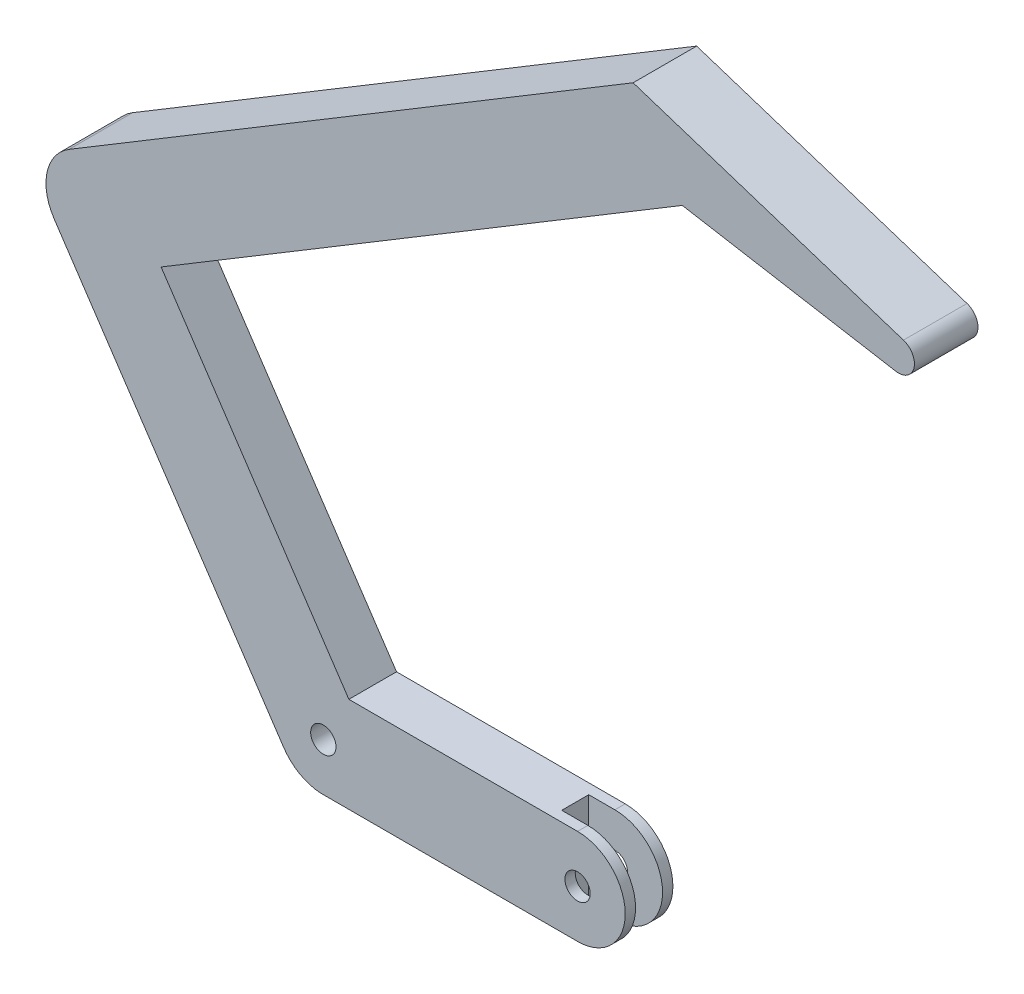
ISO-10303-21;
HEADER;
FILE_DESCRIPTION(('STEP AP214'),'2;1');
FILE_NAME('part.step','',(''),(''),'','','');
FILE_SCHEMA(('AUTOMOTIVE_DESIGN { 1 0 10303 214 1 1 1 1 }'));
ENDSEC;
DATA;
#1=APPLICATION_CONTEXT('core data for automotive mechanical design processes');
#2=APPLICATION_PROTOCOL_DEFINITION('international standard','automotive_design',2000,#1);
#3=PRODUCT_CONTEXT('',#1,'mechanical');
#4=PRODUCT('Part','Part','',(#3));
#5=PRODUCT_RELATED_PRODUCT_CATEGORY('part','',(#4));
#6=PRODUCT_DEFINITION_FORMATION('','',#4);
#7=PRODUCT_DEFINITION_CONTEXT('part definition',#1,'design');
#8=PRODUCT_DEFINITION('design','',#6,#7);
#9=PRODUCT_DEFINITION_SHAPE('','',#8);
#10=(LENGTH_UNIT() NAMED_UNIT(*) SI_UNIT(.MILLI.,.METRE.));
#11=(NAMED_UNIT(*) PLANE_ANGLE_UNIT() SI_UNIT($,.RADIAN.));
#12=(NAMED_UNIT(*) SI_UNIT($,.STERADIAN.) SOLID_ANGLE_UNIT());
#13=UNCERTAINTY_MEASURE_WITH_UNIT(LENGTH_MEASURE(1.E-05),#10,'distance_accuracy_value','');
#14=(GEOMETRIC_REPRESENTATION_CONTEXT(3) GLOBAL_UNCERTAINTY_ASSIGNED_CONTEXT((#13)) GLOBAL_UNIT_ASSIGNED_CONTEXT((#10,
#11,#12)) REPRESENTATION_CONTEXT('',''));
#15=CARTESIAN_POINT('',(0.,0.,0.));
#16=DIRECTION('',(0.,0.,1.));
#17=DIRECTION('',(1.,0.,0.));
#18=AXIS2_PLACEMENT_3D('',#15,#16,#17);
#19=CARTESIAN_POINT('',(80.,0.,15.));
#20=DIRECTION('',(0.,0.,-1.));
#21=DIRECTION('',(-1.,0.,0.));
#22=AXIS2_PLACEMENT_3D('',#19,#20,#21);
#23=CYLINDRICAL_SURFACE('',#22,15.);
#24=CARTESIAN_POINT('',(80.,0.,11.75));
#25=DIRECTION('',(0.,0.,1.));
#26=DIRECTION('',(1.,0.,0.));
#27=AXIS2_PLACEMENT_3D('',#24,#25,#26);
#28=CIRCLE('',#27,15.);
#29=CARTESIAN_POINT('',(80.,-15.,11.75));
#30=VERTEX_POINT('',#29);
#31=CARTESIAN_POINT('',(80.,15.,11.75));
#32=VERTEX_POINT('',#31);
#33=EDGE_CURVE('E333',#30,#32,#28,.T.);
#34=ORIENTED_EDGE('',*,*,#33,.T.);
#35=DIRECTION('',(0.,0.,-1.));
#36=VECTOR('',#35,1.);
#37=CARTESIAN_POINT('',(80.,15.,15.));
#38=LINE('',#37,#36);
#39=CARTESIAN_POINT('',(80.,15.,15.));
#40=VERTEX_POINT('',#39);
#41=EDGE_CURVE('E362',#40,#32,#38,.T.);
#42=ORIENTED_EDGE('',*,*,#41,.F.);
#43=CARTESIAN_POINT('',(80.,0.,15.));
#44=DIRECTION('',(0.,0.,1.));
#45=DIRECTION('',(1.,0.,0.));
#46=AXIS2_PLACEMENT_3D('',#43,#44,#45);
#47=CIRCLE('',#46,15.);
#48=CARTESIAN_POINT('',(80.,-15.,15.));
#49=VERTEX_POINT('',#48);
#50=EDGE_CURVE('E344',#49,#40,#47,.T.);
#51=ORIENTED_EDGE('',*,*,#50,.F.);
#52=DIRECTION('',(0.,0.,-1.));
#53=VECTOR('',#52,1.);
#54=CARTESIAN_POINT('',(80.,-15.,15.));
#55=LINE('',#54,#53);
#56=EDGE_CURVE('E367',#49,#30,#55,.T.);
#57=ORIENTED_EDGE('',*,*,#56,.T.);
#58=EDGE_LOOP('',(#34,#42,#51,#57));
#59=FACE_BOUND('',#58,.T.);
#60=ADVANCED_FACE('F49',(#59),#23,.T.);
#61=CARTESIAN_POINT('',(0.,-15.,15.));
#62=DIRECTION('',(0.,1.,0.));
#63=DIRECTION('',(0.,0.,1.));
#64=AXIS2_PLACEMENT_3D('',#61,#62,#63);
#65=PLANE('',#64);
#66=DIRECTION('',(1.,0.,0.));
#67=VECTOR('',#66,1.);
#68=CARTESIAN_POINT('',(0.,-15.,15.));
#69=LINE('',#68,#67);
#70=CARTESIAN_POINT('',(0.784551439243232,-15.,15.));
#71=VERTEX_POINT('',#70);
#72=EDGE_CURVE('E341',#71,#49,#69,.T.);
#73=ORIENTED_EDGE('',*,*,#72,.F.);
#74=DIRECTION('',(0.,0.,1.));
#75=VECTOR('',#74,1.);
#76=CARTESIAN_POINT('',(0.784551439243232,-15.,0.));
#77=LINE('',#76,#75);
#78=CARTESIAN_POINT('',(0.784551439243232,-15.,0.));
#79=VERTEX_POINT('',#78);
#80=EDGE_CURVE('E289',#71,#79,#77,.F.);
#81=ORIENTED_EDGE('',*,*,#80,.T.);
#82=DIRECTION('',(1.,0.,0.));
#83=VECTOR('',#82,1.);
#84=CARTESIAN_POINT('',(0.,-15.,0.));
#85=LINE('',#84,#83);
#86=CARTESIAN_POINT('',(80.,-15.,0.));
#87=VERTEX_POINT('',#86);
#88=EDGE_CURVE('E340',#79,#87,#85,.T.);
#89=ORIENTED_EDGE('',*,*,#88,.T.);
#90=CARTESIAN_POINT('',(80.,-15.,3.25));
#91=VERTEX_POINT('',#90);
#92=EDGE_CURVE('E366',#91,#87,#55,.T.);
#93=ORIENTED_EDGE('',*,*,#92,.F.);
#94=DIRECTION('',(-1.,0.,0.));
#95=VECTOR('',#94,1.);
#96=CARTESIAN_POINT('',(0.,-15.,3.25));
#97=LINE('',#96,#95);
#98=CARTESIAN_POINT('',(71.7692085698296,-15.,3.25));
#99=VERTEX_POINT('',#98);
#100=EDGE_CURVE('E329',#91,#99,#97,.T.);
#101=ORIENTED_EDGE('',*,*,#100,.T.);
#102=DIRECTION('',(0.,0.,1.));
#103=VECTOR('',#102,1.);
#104=CARTESIAN_POINT('',(71.7692085698296,-15.,15.));
#105=LINE('',#104,#103);
#106=CARTESIAN_POINT('',(71.7692085698296,-15.,11.75));
#107=VERTEX_POINT('',#106);
#108=EDGE_CURVE('E319',#99,#107,#105,.T.);
#109=ORIENTED_EDGE('',*,*,#108,.T.);
#110=DIRECTION('',(1.,0.,0.));
#111=VECTOR('',#110,1.);
#112=CARTESIAN_POINT('',(0.,-15.,11.75));
#113=LINE('',#112,#111);
#114=EDGE_CURVE('E336',#107,#30,#113,.T.);
#115=ORIENTED_EDGE('',*,*,#114,.T.);
#116=ORIENTED_EDGE('',*,*,#56,.F.);
#117=EDGE_LOOP('',(#73,#81,#89,#93,#101,#109,#115,#116));
#118=FACE_BOUND('',#117,.T.);
#119=ADVANCED_FACE('F489',(#118),#65,.F.);
#120=CARTESIAN_POINT('',(80.,15.,3.25));
#121=VERTEX_POINT('',#120);
#122=CARTESIAN_POINT('',(80.,15.,0.));
#123=VERTEX_POINT('',#122);
#124=EDGE_CURVE('E352',#121,#123,#38,.T.);
#125=ORIENTED_EDGE('',*,*,#124,.F.);
#126=CARTESIAN_POINT('',(80.,0.,3.25));
#127=DIRECTION('',(0.,0.,-1.));
#128=DIRECTION('',(-1.,0.,0.));
#129=AXIS2_PLACEMENT_3D('',#126,#127,#128);
#130=CIRCLE('',#129,15.);
#131=EDGE_CURVE('E325',#121,#91,#130,.T.);
#132=ORIENTED_EDGE('',*,*,#131,.T.);
#133=ORIENTED_EDGE('',*,*,#92,.T.);
#134=CARTESIAN_POINT('',(80.,0.,0.));
#135=DIRECTION('',(0.,0.,1.));
#136=DIRECTION('',(1.,0.,0.));
#137=AXIS2_PLACEMENT_3D('',#134,#135,#136);
#138=CIRCLE('',#137,15.);
#139=EDGE_CURVE('E355',#87,#123,#138,.T.);
#140=ORIENTED_EDGE('',*,*,#139,.T.);
#141=EDGE_LOOP('',(#125,#132,#133,#140));
#142=FACE_BOUND('',#141,.T.);
#143=ADVANCED_FACE('F460',(#142),#23,.T.);
#144=CARTESIAN_POINT('',(0.,15.,15.));
#145=DIRECTION('',(0.,-1.,0.));
#146=DIRECTION('',(0.,0.,-1.));
#147=AXIS2_PLACEMENT_3D('',#144,#145,#146);
#148=PLANE('',#147);
#149=DIRECTION('',(-1.,0.,0.));
#150=VECTOR('',#149,1.);
#151=CARTESIAN_POINT('',(0.,15.,0.));
#152=LINE('',#151,#150);
#153=CARTESIAN_POINT('',(8.03505045378055,15.,0.));
#154=VERTEX_POINT('',#153);
#155=EDGE_CURVE('E345',#123,#154,#152,.T.);
#156=ORIENTED_EDGE('',*,*,#155,.T.);
#157=DIRECTION('',(0.,0.,1.));
#158=VECTOR('',#157,1.);
#159=CARTESIAN_POINT('',(8.03505045378055,15.,15.));
#160=LINE('',#159,#158);
#161=CARTESIAN_POINT('',(8.03505045378055,15.,15.));
#162=VERTEX_POINT('',#161);
#163=EDGE_CURVE('E283',#154,#162,#160,.T.);
#164=ORIENTED_EDGE('',*,*,#163,.T.);
#165=DIRECTION('',(-1.,0.,0.));
#166=VECTOR('',#165,1.);
#167=CARTESIAN_POINT('',(0.,15.,15.));
#168=LINE('',#167,#166);
#169=EDGE_CURVE('E348',#40,#162,#168,.T.);
#170=ORIENTED_EDGE('',*,*,#169,.F.);
#171=ORIENTED_EDGE('',*,*,#41,.T.);
#172=DIRECTION('',(-1.,0.,0.));
#173=VECTOR('',#172,1.);
#174=CARTESIAN_POINT('',(0.,15.,11.75));
#175=LINE('',#174,#173);
#176=CARTESIAN_POINT('',(71.7692085698296,15.,11.75));
#177=VERTEX_POINT('',#176);
#178=EDGE_CURVE('E371',#32,#177,#175,.T.);
#179=ORIENTED_EDGE('',*,*,#178,.T.);
#180=DIRECTION('',(0.,0.,-1.));
#181=VECTOR('',#180,1.);
#182=CARTESIAN_POINT('',(71.7692085698296,15.,11.75));
#183=LINE('',#182,#181);
#184=CARTESIAN_POINT('',(71.7692085698296,15.,3.25));
#185=VERTEX_POINT('',#184);
#186=EDGE_CURVE('E306',#177,#185,#183,.T.);
#187=ORIENTED_EDGE('',*,*,#186,.T.);
#188=DIRECTION('',(1.,0.,0.));
#189=VECTOR('',#188,1.);
#190=CARTESIAN_POINT('',(71.7692085698296,15.,3.25));
#191=LINE('',#190,#189);
#192=EDGE_CURVE('E310',#185,#121,#191,.T.);
#193=ORIENTED_EDGE('',*,*,#192,.T.);
#194=ORIENTED_EDGE('',*,*,#124,.T.);
#195=EDGE_LOOP('',(#156,#164,#170,#171,#179,#187,#193,#194));
#196=FACE_BOUND('',#195,.T.);
#197=ADVANCED_FACE('F456',(#196),#148,.F.);
#198=CARTESIAN_POINT('',(0.,0.,15.));
#199=DIRECTION('',(0.,0.,1.));
#200=DIRECTION('',(1.,0.,0.));
#201=AXIS2_PLACEMENT_3D('',#198,#199,#200);
#202=PLANE('',#201);
#203=DIRECTION('',(0.985426337156866,-0.170102716138227,0.));
#204=VECTOR('',#203,1.);
#205=CARTESIAN_POINT('',(249.011128894695,178.572894151073,15.));
#206=LINE('',#205,#204);
#207=CARTESIAN_POINT('',(112.956276539485,202.058464869814,15.));
#208=VERTEX_POINT('',#207);
#209=CARTESIAN_POINT('',(180.158514372488,190.458122200932,15.));
#210=VERTEX_POINT('',#209);
#211=EDGE_CURVE('E227',#208,#210,#206,.T.);
#212=ORIENTED_EDGE('',*,*,#211,.T.);
#213=CARTESIAN_POINT('',(181.009027953179,195.385253886716,15.));
#214=DIRECTION('',(0.,0.,1.));
#215=DIRECTION('',(1.,0.,0.));
#216=AXIS2_PLACEMENT_3D('',#213,#214,#215);
#217=CIRCLE('',#216,5.);
#218=CARTESIAN_POINT('',(182.552458959952,200.141073556061,15.));
#219=VERTEX_POINT('',#218);
#220=EDGE_CURVE('E72',#210,#219,#217,.T.);
#221=ORIENTED_EDGE('',*,*,#220,.T.);
#222=DIRECTION('',(-0.951163933869031,0.308686201354691,0.));
#223=VECTOR('',#222,1.);
#224=CARTESIAN_POINT('',(97.4842129327797,227.748715926624,15.));
#225=LINE('',#224,#223);
#226=CARTESIAN_POINT('',(97.4842129327797,227.748715926624,15.));
#227=VERTEX_POINT('',#226);
#228=EDGE_CURVE('E210',#219,#227,#225,.T.);
#229=ORIENTED_EDGE('',*,*,#228,.T.);
#230=DIRECTION('',(-0.85663979225182,-0.515914979750306,0.));
#231=VECTOR('',#230,1.);
#232=CARTESIAN_POINT('',(-80.0186432183615,120.846861418893,15.));
#233=LINE('',#232,#231);
#234=CARTESIAN_POINT('',(-80.0186432183615,120.846861418893,15.));
#235=VERTEX_POINT('',#234);
#236=EDGE_CURVE('E203',#227,#235,#233,.T.);
#237=ORIENTED_EDGE('',*,*,#236,.T.);
#238=CARTESIAN_POINT('',(-72.282611415009,108.001735890487,15.));
#239=DIRECTION('',(0.,0.,1.));
#240=DIRECTION('',(1.,0.,0.));
#241=AXIS2_PLACEMENT_3D('',#238,#239,#240);
#242=CIRCLE('',#241,14.994780355276);
#243=CARTESIAN_POINT('',(-84.7671388117334,99.6963151556052,15.));
#244=VERTEX_POINT('',#243);
#245=EDGE_CURVE('E220',#235,#244,#242,.T.);
#246=ORIENTED_EDGE('',*,*,#245,.T.);
#247=DIRECTION('',(0.832591548587215,0.553887455374415,0.));
#248=VECTOR('',#247,1.);
#249=CARTESIAN_POINT('',(-71.9819753408451,108.201736179218,15.));
#250=LINE('',#249,#248);
#251=CARTESIAN_POINT('',(-84.7886038342346,99.682035396565,15.));
#252=VERTEX_POINT('',#251);
#253=EDGE_CURVE('E248',#252,#244,#250,.T.);
#254=ORIENTED_EDGE('',*,*,#253,.F.);
#255=DIRECTION('',(0.556198645236398,-0.831049377015106,0.));
#256=VECTOR('',#255,1.);
#257=CARTESIAN_POINT('',(-12.4827799535029,-8.35438361539881,15.));
#258=LINE('',#257,#256);
#259=CARTESIAN_POINT('',(-12.4827799535029,-8.35438361539881,15.));
#260=VERTEX_POINT('',#259);
#261=EDGE_CURVE('E260',#252,#260,#258,.T.);
#262=ORIENTED_EDGE('',*,*,#261,.T.);
#263=CARTESIAN_POINT('',(0.,0.,15.));
#264=DIRECTION('',(0.,0.,1.));
#265=DIRECTION('',(1.,0.,0.));
#266=AXIS2_PLACEMENT_3D('',#263,#264,#265);
#267=CIRCLE('',#266,15.0205033524452);
#268=EDGE_CURVE('E269',#260,#71,#267,.T.);
#269=ORIENTED_EDGE('',*,*,#268,.T.);
#270=ORIENTED_EDGE('',*,*,#72,.T.);
#271=ORIENTED_EDGE('',*,*,#50,.T.);
#272=ORIENTED_EDGE('',*,*,#169,.T.);
#273=DIRECTION('',(-0.556198645236398,0.831049377015106,0.));
#274=VECTOR('',#273,1.);
#275=CARTESIAN_POINT('',(12.4827799535029,8.35438361539881,15.));
#276=LINE('',#275,#274);
#277=CARTESIAN_POINT('',(-51.0511952305995,103.284263341374,15.));
#278=VERTEX_POINT('',#277);
#279=EDGE_CURVE('E273',#162,#278,#276,.T.);
#280=ORIENTED_EDGE('',*,*,#279,.T.);
#281=DIRECTION('',(0.85663979225182,0.515914979750306,0.));
#282=VECTOR('',#281,1.);
#283=CARTESIAN_POINT('',(-64.5465796116565,95.1566103620819,15.));
#284=LINE('',#283,#282);
#285=EDGE_CURVE('E224',#278,#208,#284,.T.);
#286=ORIENTED_EDGE('',*,*,#285,.T.);
#287=EDGE_LOOP('',(#212,#221,#229,#237,#246,#254,#262,#269,#270,#271,#272,#280,#286));
#288=FACE_BOUND('',#287,.T.);
#289=CARTESIAN_POINT('',(0.,0.,15.));
#290=DIRECTION('',(0.,0.,-1.));
#291=DIRECTION('',(-1.,0.,0.));
#292=AXIS2_PLACEMENT_3D('',#289,#290,#291);
#293=CIRCLE('',#292,3.985);
#294=CARTESIAN_POINT('',(-3.985,0.,15.));
#295=VERTEX_POINT('',#294);
#296=EDGE_CURVE('E251',#295,#295,#293,.T.);
#297=ORIENTED_EDGE('',*,*,#296,.T.);
#298=EDGE_LOOP('',(#297));
#299=FACE_BOUND('',#298,.T.);
#300=CARTESIAN_POINT('',(80.,0.,15.));
#301=DIRECTION('',(0.,0.,-1.));
#302=DIRECTION('',(-1.,0.,0.));
#303=AXIS2_PLACEMENT_3D('',#300,#301,#302);
#304=CIRCLE('',#303,3.985);
#305=CARTESIAN_POINT('',(76.015,0.,15.));
#306=VERTEX_POINT('',#305);
#307=EDGE_CURVE('E293',#306,#306,#304,.T.);
#308=ORIENTED_EDGE('',*,*,#307,.T.);
#309=EDGE_LOOP('',(#308));
#310=FACE_BOUND('',#309,.T.);
#311=ADVANCED_FACE('F471',(#288,#299,#310),#202,.T.);
#312=CARTESIAN_POINT('',(0.,0.,0.));
#313=DIRECTION('',(0.,0.,1.));
#314=DIRECTION('',(1.,0.,0.));
#315=AXIS2_PLACEMENT_3D('',#312,#313,#314);
#316=PLANE('',#315);
#317=CARTESIAN_POINT('',(0.,0.,0.));
#318=DIRECTION('',(0.,0.,1.));
#319=DIRECTION('',(1.,0.,0.));
#320=AXIS2_PLACEMENT_3D('',#317,#318,#319);
#321=CIRCLE('',#320,3.985);
#322=CARTESIAN_POINT('',(3.985,0.,0.));
#323=VERTEX_POINT('',#322);
#324=EDGE_CURVE('E255',#323,#323,#321,.T.);
#325=ORIENTED_EDGE('',*,*,#324,.T.);
#326=EDGE_LOOP('',(#325));
#327=FACE_BOUND('',#326,.T.);
#328=DIRECTION('',(0.832591548587214,0.553887455374415,0.));
#329=VECTOR('',#328,1.);
#330=CARTESIAN_POINT('',(-89.0976356227042,96.8154213209203,0.));
#331=LINE('',#330,#329);
#332=CARTESIAN_POINT('',(-84.7886038342346,99.682035396565,0.));
#333=VERTEX_POINT('',#332);
#334=CARTESIAN_POINT('',(-84.7671388117334,99.6963151556051,0.));
#335=VERTEX_POINT('',#334);
#336=EDGE_CURVE('E244',#333,#335,#331,.T.);
#337=ORIENTED_EDGE('',*,*,#336,.T.);
#338=CARTESIAN_POINT('',(-72.282611415009,108.001735890487,0.));
#339=DIRECTION('',(0.,0.,1.));
#340=DIRECTION('',(1.,0.,0.));
#341=AXIS2_PLACEMENT_3D('',#338,#339,#340);
#342=CIRCLE('',#341,14.994780355276);
#343=CARTESIAN_POINT('',(-64.5465796116565,95.1566103620819,0.));
#344=VERTEX_POINT('',#343);
#345=EDGE_CURVE('E234',#335,#344,#342,.T.);
#346=ORIENTED_EDGE('',*,*,#345,.T.);
#347=DIRECTION('',(0.85663979225182,0.515914979750306,0.));
#348=VECTOR('',#347,1.);
#349=CARTESIAN_POINT('',(-59.2350292612451,98.3555142844317,0.));
#350=LINE('',#349,#348);
#351=CARTESIAN_POINT('',(-51.0511952305995,103.284263341374,0.));
#352=VERTEX_POINT('',#351);
#353=EDGE_CURVE('E180',#344,#352,#350,.T.);
#354=ORIENTED_EDGE('',*,*,#353,.T.);
#355=DIRECTION('',(-0.556198645236398,0.831049377015106,0.));
#356=VECTOR('',#355,1.);
#357=CARTESIAN_POINT('',(12.4827799535029,8.35438361539881,0.));
#358=LINE('',#357,#356);
#359=EDGE_CURVE('E259',#154,#352,#358,.T.);
#360=ORIENTED_EDGE('',*,*,#359,.F.);
#361=ORIENTED_EDGE('',*,*,#155,.F.);
#362=ORIENTED_EDGE('',*,*,#139,.F.);
#363=ORIENTED_EDGE('',*,*,#88,.F.);
#364=CARTESIAN_POINT('',(0.,0.,0.));
#365=DIRECTION('',(0.,0.,1.));
#366=DIRECTION('',(1.,0.,0.));
#367=AXIS2_PLACEMENT_3D('',#364,#365,#366);
#368=CIRCLE('',#367,15.0205033524452);
#369=CARTESIAN_POINT('',(-12.4827799535029,-8.35438361539881,0.));
#370=VERTEX_POINT('',#369);
#371=EDGE_CURVE('E256',#370,#79,#368,.T.);
#372=ORIENTED_EDGE('',*,*,#371,.F.);
#373=DIRECTION('',(0.556198645236398,-0.831049377015106,0.));
#374=VECTOR('',#373,1.);
#375=CARTESIAN_POINT('',(-12.4827799535029,-8.35438361539881,0.));
#376=LINE('',#375,#374);
#377=EDGE_CURVE('E264',#333,#370,#376,.T.);
#378=ORIENTED_EDGE('',*,*,#377,.F.);
#379=EDGE_LOOP('',(#337,#346,#354,#360,#361,#362,#363,#372,#378));
#380=FACE_BOUND('',#379,.T.);
#381=CARTESIAN_POINT('',(80.,0.,0.));
#382=DIRECTION('',(0.,0.,1.));
#383=DIRECTION('',(1.,0.,0.));
#384=AXIS2_PLACEMENT_3D('',#381,#382,#383);
#385=CIRCLE('',#384,3.985);
#386=CARTESIAN_POINT('',(83.985,0.,0.));
#387=VERTEX_POINT('',#386);
#388=EDGE_CURVE('E302',#387,#387,#385,.T.);
#389=ORIENTED_EDGE('',*,*,#388,.T.);
#390=EDGE_LOOP('',(#389));
#391=FACE_BOUND('',#390,.T.);
#392=ADVANCED_FACE('F465',(#327,#380,#391),#316,.F.);
#393=CARTESIAN_POINT('',(95.,15.,11.75));
#394=DIRECTION('',(0.,0.,1.));
#395=DIRECTION('',(1.,0.,0.));
#396=AXIS2_PLACEMENT_3D('',#393,#394,#395);
#397=PLANE('',#396);
#398=CARTESIAN_POINT('',(80.,0.,11.75));
#399=DIRECTION('',(0.,0.,1.));
#400=DIRECTION('',(1.,0.,0.));
#401=AXIS2_PLACEMENT_3D('',#398,#399,#400);
#402=CIRCLE('',#401,3.985);
#403=CARTESIAN_POINT('',(83.985,0.,11.75));
#404=VERTEX_POINT('',#403);
#405=EDGE_CURVE('E298',#404,#404,#402,.T.);
#406=ORIENTED_EDGE('',*,*,#405,.T.);
#407=EDGE_LOOP('',(#406));
#408=FACE_BOUND('',#407,.T.);
#409=DIRECTION('',(0.,-1.,0.));
#410=VECTOR('',#409,1.);
#411=CARTESIAN_POINT('',(71.7692085698296,15.,11.75));
#412=LINE('',#411,#410);
#413=EDGE_CURVE('E314',#177,#107,#412,.T.);
#414=ORIENTED_EDGE('',*,*,#413,.F.);
#415=ORIENTED_EDGE('',*,*,#178,.F.);
#416=ORIENTED_EDGE('',*,*,#33,.F.);
#417=ORIENTED_EDGE('',*,*,#114,.F.);
#418=EDGE_LOOP('',(#414,#415,#416,#417));
#419=FACE_BOUND('',#418,.T.);
#420=ADVANCED_FACE('F480',(#408,#419),#397,.F.);
#421=CARTESIAN_POINT('',(71.7692085698296,15.,3.25));
#422=DIRECTION('',(0.,0.,-1.));
#423=DIRECTION('',(-1.,0.,0.));
#424=AXIS2_PLACEMENT_3D('',#421,#422,#423);
#425=PLANE('',#424);
#426=CARTESIAN_POINT('',(80.,0.,3.25));
#427=DIRECTION('',(0.,0.,-1.));
#428=DIRECTION('',(-1.,0.,0.));
#429=AXIS2_PLACEMENT_3D('',#426,#427,#428);
#430=CIRCLE('',#429,3.985);
#431=CARTESIAN_POINT('',(76.015,0.,3.25));
#432=VERTEX_POINT('',#431);
#433=EDGE_CURVE('E297',#432,#432,#430,.T.);
#434=ORIENTED_EDGE('',*,*,#433,.T.);
#435=EDGE_LOOP('',(#434));
#436=FACE_BOUND('',#435,.T.);
#437=ORIENTED_EDGE('',*,*,#131,.F.);
#438=ORIENTED_EDGE('',*,*,#192,.F.);
#439=DIRECTION('',(0.,-1.,0.));
#440=VECTOR('',#439,1.);
#441=CARTESIAN_POINT('',(71.7692085698296,15.,3.25));
#442=LINE('',#441,#440);
#443=EDGE_CURVE('E315',#185,#99,#442,.T.);
#444=ORIENTED_EDGE('',*,*,#443,.T.);
#445=ORIENTED_EDGE('',*,*,#100,.F.);
#446=EDGE_LOOP('',(#437,#438,#444,#445));
#447=FACE_BOUND('',#446,.T.);
#448=ADVANCED_FACE('F486',(#436,#447),#425,.F.);
#449=CARTESIAN_POINT('',(71.7692085698296,15.,11.75));
#450=DIRECTION('',(-1.,0.,0.));
#451=DIRECTION('',(0.,0.,1.));
#452=AXIS2_PLACEMENT_3D('',#449,#450,#451);
#453=PLANE('',#452);
#454=ORIENTED_EDGE('',*,*,#443,.F.);
#455=ORIENTED_EDGE('',*,*,#186,.F.);
#456=ORIENTED_EDGE('',*,*,#413,.T.);
#457=ORIENTED_EDGE('',*,*,#108,.F.);
#458=EDGE_LOOP('',(#454,#455,#456,#457));
#459=FACE_BOUND('',#458,.T.);
#460=ADVANCED_FACE('F484',(#459),#453,.F.);
#461=CARTESIAN_POINT('',(80.,0.,15.));
#462=DIRECTION('',(0.,0.,-1.));
#463=DIRECTION('',(-1.,0.,0.));
#464=AXIS2_PLACEMENT_3D('',#461,#462,#463);
#465=CYLINDRICAL_SURFACE('',#464,3.985);
#466=ORIENTED_EDGE('',*,*,#433,.F.);
#467=EDGE_LOOP('',(#466));
#468=FACE_BOUND('',#467,.T.);
#469=ORIENTED_EDGE('',*,*,#388,.F.);
#470=EDGE_LOOP('',(#469));
#471=FACE_BOUND('',#470,.T.);
#472=ADVANCED_FACE('F540',(#468,#471),#465,.F.);
#473=ORIENTED_EDGE('',*,*,#307,.F.);
#474=EDGE_LOOP('',(#473));
#475=FACE_BOUND('',#474,.T.);
#476=ORIENTED_EDGE('',*,*,#405,.F.);
#477=EDGE_LOOP('',(#476));
#478=FACE_BOUND('',#477,.T.);
#479=ADVANCED_FACE('F546',(#475,#478),#465,.F.);
#480=CARTESIAN_POINT('',(0.,0.,0.));
#481=DIRECTION('',(0.,0.,1.));
#482=DIRECTION('',(1.,0.,0.));
#483=AXIS2_PLACEMENT_3D('',#480,#481,#482);
#484=CYLINDRICAL_SURFACE('',#483,15.0205033524452);
#485=ORIENTED_EDGE('',*,*,#80,.F.);
#486=ORIENTED_EDGE('',*,*,#268,.F.);
#487=DIRECTION('',(0.,0.,1.));
#488=VECTOR('',#487,1.);
#489=CARTESIAN_POINT('',(-12.4827799535029,-8.35438361539881,0.));
#490=LINE('',#489,#488);
#491=EDGE_CURVE('E280',#370,#260,#490,.T.);
#492=ORIENTED_EDGE('',*,*,#491,.F.);
#493=ORIENTED_EDGE('',*,*,#371,.T.);
#494=EDGE_LOOP('',(#485,#486,#492,#493));
#495=FACE_BOUND('',#494,.T.);
#496=ADVANCED_FACE('F548',(#495),#484,.T.);
#497=CARTESIAN_POINT('',(12.4827799535029,8.35438361539881,0.));
#498=DIRECTION('',(0.831049377015106,0.556198645236398,0.));
#499=DIRECTION('',(-0.556198645236398,0.831049377015106,0.));
#500=AXIS2_PLACEMENT_3D('',#497,#498,#499);
#501=PLANE('',#500);
#502=DIRECTION('',(0.,0.,-1.));
#503=VECTOR('',#502,1.);
#504=CARTESIAN_POINT('',(-51.0511952305995,103.284263341374,0.));
#505=LINE('',#504,#503);
#506=EDGE_CURVE('E384',#278,#352,#505,.T.);
#507=ORIENTED_EDGE('',*,*,#506,.F.);
#508=ORIENTED_EDGE('',*,*,#279,.F.);
#509=ORIENTED_EDGE('',*,*,#163,.F.);
#510=ORIENTED_EDGE('',*,*,#359,.T.);
#511=EDGE_LOOP('',(#507,#508,#509,#510));
#512=FACE_BOUND('',#511,.T.);
#513=ADVANCED_FACE('F468',(#512),#501,.T.);
#514=CARTESIAN_POINT('',(-12.4827799535029,-8.35438361539881,0.));
#515=DIRECTION('',(-0.831049377015106,-0.556198645236398,0.));
#516=DIRECTION('',(0.556198645236398,-0.831049377015106,0.));
#517=AXIS2_PLACEMENT_3D('',#514,#515,#516);
#518=PLANE('',#517);
#519=ORIENTED_EDGE('',*,*,#261,.F.);
#520=DIRECTION('',(0.,0.,1.));
#521=VECTOR('',#520,1.);
#522=CARTESIAN_POINT('',(-84.7886038342346,99.682035396565,0.));
#523=LINE('',#522,#521);
#524=EDGE_CURVE('E268',#333,#252,#523,.T.);
#525=ORIENTED_EDGE('',*,*,#524,.F.);
#526=ORIENTED_EDGE('',*,*,#377,.T.);
#527=ORIENTED_EDGE('',*,*,#491,.T.);
#528=EDGE_LOOP('',(#519,#525,#526,#527));
#529=FACE_BOUND('',#528,.T.);
#530=ADVANCED_FACE('F496',(#529),#518,.T.);
#531=CARTESIAN_POINT('',(0.,0.,15.));
#532=DIRECTION('',(0.,0.,-1.));
#533=DIRECTION('',(-1.,0.,0.));
#534=AXIS2_PLACEMENT_3D('',#531,#532,#533);
#535=CYLINDRICAL_SURFACE('',#534,3.985);
#536=ORIENTED_EDGE('',*,*,#296,.F.);
#537=EDGE_LOOP('',(#536));
#538=FACE_BOUND('',#537,.T.);
#539=ORIENTED_EDGE('',*,*,#324,.F.);
#540=EDGE_LOOP('',(#539));
#541=FACE_BOUND('',#540,.T.);
#542=ADVANCED_FACE('F555',(#538,#541),#535,.F.);
#543=CARTESIAN_POINT('',(-84.7886038342346,99.682035396565,0.));
#544=DIRECTION('',(0.553887455374415,-0.832591548587215,0.));
#545=DIRECTION('',(0.832591548587215,0.553887455374415,0.));
#546=AXIS2_PLACEMENT_3D('',#543,#544,#545);
#547=PLANE('',#546);
#548=ORIENTED_EDGE('',*,*,#253,.T.);
#549=DIRECTION('',(0.,0.,1.));
#550=VECTOR('',#549,1.);
#551=CARTESIAN_POINT('',(-84.7671388117334,99.6963151556052,-5.));
#552=LINE('',#551,#550);
#553=EDGE_CURVE('E375',#244,#335,#552,.F.);
#554=ORIENTED_EDGE('',*,*,#553,.T.);
#555=ORIENTED_EDGE('',*,*,#336,.F.);
#556=ORIENTED_EDGE('',*,*,#524,.T.);
#557=EDGE_LOOP('',(#548,#554,#555,#556));
#558=FACE_BOUND('',#557,.T.);
#559=ADVANCED_FACE('F500',(#558),#547,.F.);
#560=CARTESIAN_POINT('',(-64.5465796116565,95.1566103620819,-5.));
#561=DIRECTION('',(0.515914979750306,-0.85663979225182,0.));
#562=DIRECTION('',(0.85663979225182,0.515914979750306,0.));
#563=AXIS2_PLACEMENT_3D('',#560,#561,#562);
#564=PLANE('',#563);
#565=ORIENTED_EDGE('',*,*,#353,.F.);
#566=DIRECTION('',(0.,0.,1.));
#567=VECTOR('',#566,1.);
#568=CARTESIAN_POINT('',(-64.5465796116565,95.1566103620819,-5.));
#569=LINE('',#568,#567);
#570=CARTESIAN_POINT('',(-64.5465796116565,95.1566103620819,-5.));
#571=VERTEX_POINT('',#570);
#572=EDGE_CURVE('E174',#571,#344,#569,.T.);
#573=ORIENTED_EDGE('',*,*,#572,.F.);
#574=DIRECTION('',(0.85663979225182,0.515914979750306,0.));
#575=VECTOR('',#574,1.);
#576=CARTESIAN_POINT('',(-64.5465796116565,95.1566103620819,-5.));
#577=LINE('',#576,#575);
#578=CARTESIAN_POINT('',(112.956276539485,202.058464869814,-5.));
#579=VERTEX_POINT('',#578);
#580=EDGE_CURVE('E178',#571,#579,#577,.T.);
#581=ORIENTED_EDGE('',*,*,#580,.T.);
#582=DIRECTION('',(0.,0.,1.));
#583=VECTOR('',#582,1.);
#584=CARTESIAN_POINT('',(112.956276539485,202.058464869814,-5.));
#585=LINE('',#584,#583);
#586=EDGE_CURVE('E185',#579,#208,#585,.T.);
#587=ORIENTED_EDGE('',*,*,#586,.T.);
#588=ORIENTED_EDGE('',*,*,#285,.F.);
#589=ORIENTED_EDGE('',*,*,#506,.T.);
#590=EDGE_LOOP('',(#565,#573,#581,#587,#588,#589));
#591=FACE_BOUND('',#590,.T.);
#592=ADVANCED_FACE('F176',(#591),#564,.T.);
#593=CARTESIAN_POINT('',(-72.282611415009,108.001735890487,-5.));
#594=DIRECTION('',(0.,0.,1.));
#595=DIRECTION('',(1.,0.,0.));
#596=AXIS2_PLACEMENT_3D('',#593,#594,#595);
#597=CYLINDRICAL_SURFACE('',#596,14.994780355276);
#598=ORIENTED_EDGE('',*,*,#345,.F.);
#599=ORIENTED_EDGE('',*,*,#553,.F.);
#600=ORIENTED_EDGE('',*,*,#245,.F.);
#601=DIRECTION('',(0.,0.,1.));
#602=VECTOR('',#601,1.);
#603=CARTESIAN_POINT('',(-80.0186432183615,120.846861418893,-5.));
#604=LINE('',#603,#602);
#605=CARTESIAN_POINT('',(-80.0186432183615,120.846861418893,-5.));
#606=VERTEX_POINT('',#605);
#607=EDGE_CURVE('E201',#606,#235,#604,.T.);
#608=ORIENTED_EDGE('',*,*,#607,.F.);
#609=CARTESIAN_POINT('',(-72.282611415009,108.001735890487,-5.));
#610=DIRECTION('',(0.,0.,1.));
#611=DIRECTION('',(1.,0.,0.));
#612=AXIS2_PLACEMENT_3D('',#609,#610,#611);
#613=CIRCLE('',#612,14.994780355276);
#614=EDGE_CURVE('E193',#606,#571,#613,.T.);
#615=ORIENTED_EDGE('',*,*,#614,.T.);
#616=ORIENTED_EDGE('',*,*,#572,.T.);
#617=EDGE_LOOP('',(#598,#599,#600,#608,#615,#616));
#618=FACE_BOUND('',#617,.T.);
#619=ADVANCED_FACE('F199',(#618),#597,.T.);
#620=CARTESIAN_POINT('',(-80.0186432183615,120.846861418893,-5.));
#621=DIRECTION('',(-0.515914979750306,0.85663979225182,0.));
#622=DIRECTION('',(-0.85663979225182,-0.515914979750306,0.));
#623=AXIS2_PLACEMENT_3D('',#620,#621,#622);
#624=PLANE('',#623);
#625=ORIENTED_EDGE('',*,*,#236,.F.);
#626=DIRECTION('',(0.,0.,1.));
#627=VECTOR('',#626,1.);
#628=CARTESIAN_POINT('',(97.4842129327797,227.748715926624,-5.));
#629=LINE('',#628,#627);
#630=CARTESIAN_POINT('',(97.4842129327797,227.748715926624,-5.));
#631=VERTEX_POINT('',#630);
#632=EDGE_CURVE('E235',#631,#227,#629,.T.);
#633=ORIENTED_EDGE('',*,*,#632,.F.);
#634=DIRECTION('',(-0.85663979225182,-0.515914979750306,0.));
#635=VECTOR('',#634,1.);
#636=CARTESIAN_POINT('',(-80.0186432183615,120.846861418893,-5.));
#637=LINE('',#636,#635);
#638=EDGE_CURVE('E186',#631,#606,#637,.T.);
#639=ORIENTED_EDGE('',*,*,#638,.T.);
#640=ORIENTED_EDGE('',*,*,#607,.T.);
#641=EDGE_LOOP('',(#625,#633,#639,#640));
#642=FACE_BOUND('',#641,.T.);
#643=ADVANCED_FACE('F505',(#642),#624,.T.);
#644=CARTESIAN_POINT('',(97.4842129327797,227.748715926624,-5.));
#645=DIRECTION('',(0.308686201354691,0.951163933869031,0.));
#646=DIRECTION('',(-0.951163933869031,0.308686201354691,0.));
#647=AXIS2_PLACEMENT_3D('',#644,#645,#646);
#648=PLANE('',#647);
#649=ORIENTED_EDGE('',*,*,#228,.F.);
#650=DIRECTION('',(0.,0.,1.));
#651=VECTOR('',#650,1.);
#652=CARTESIAN_POINT('',(182.552458959952,200.141073556061,-5.));
#653=LINE('',#652,#651);
#654=CARTESIAN_POINT('',(182.552458959952,200.141073556061,-5.));
#655=VERTEX_POINT('',#654);
#656=EDGE_CURVE('E58',#219,#655,#653,.F.);
#657=ORIENTED_EDGE('',*,*,#656,.T.);
#658=DIRECTION('',(-0.951163933869031,0.308686201354691,0.));
#659=VECTOR('',#658,1.);
#660=CARTESIAN_POINT('',(97.4842129327797,227.748715926624,-5.));
#661=LINE('',#660,#659);
#662=EDGE_CURVE('E215',#655,#631,#661,.T.);
#663=ORIENTED_EDGE('',*,*,#662,.T.);
#664=ORIENTED_EDGE('',*,*,#632,.T.);
#665=EDGE_LOOP('',(#649,#657,#663,#664));
#666=FACE_BOUND('',#665,.T.);
#667=ADVANCED_FACE('F512',(#666),#648,.T.);
#668=CARTESIAN_POINT('',(249.011128894695,178.572894151073,-5.));
#669=DIRECTION('',(-0.170102716138227,-0.985426337156866,0.));
#670=DIRECTION('',(0.985426337156866,-0.170102716138227,0.));
#671=AXIS2_PLACEMENT_3D('',#668,#669,#670);
#672=PLANE('',#671);
#673=DIRECTION('',(0.985426337156866,-0.170102716138227,0.));
#674=VECTOR('',#673,1.);
#675=CARTESIAN_POINT('',(249.011128894695,178.572894151073,-5.));
#676=LINE('',#675,#674);
#677=CARTESIAN_POINT('',(180.158514372488,190.458122200932,-5.));
#678=VERTEX_POINT('',#677);
#679=EDGE_CURVE('E196',#579,#678,#676,.T.);
#680=ORIENTED_EDGE('',*,*,#679,.T.);
#681=DIRECTION('',(0.,0.,1.));
#682=VECTOR('',#681,1.);
#683=CARTESIAN_POINT('',(180.158514372488,190.458122200932,-5.));
#684=LINE('',#683,#682);
#685=EDGE_CURVE('E387',#678,#210,#684,.T.);
#686=ORIENTED_EDGE('',*,*,#685,.T.);
#687=ORIENTED_EDGE('',*,*,#211,.F.);
#688=ORIENTED_EDGE('',*,*,#586,.F.);
#689=EDGE_LOOP('',(#680,#686,#687,#688));
#690=FACE_BOUND('',#689,.T.);
#691=ADVANCED_FACE('F510',(#690),#672,.T.);
#692=CARTESIAN_POINT('',(-72.282611415009,108.001735890487,-5.));
#693=DIRECTION('',(0.,0.,1.));
#694=DIRECTION('',(1.,0.,0.));
#695=AXIS2_PLACEMENT_3D('',#692,#693,#694);
#696=PLANE('',#695);
#697=ORIENTED_EDGE('',*,*,#662,.F.);
#698=CARTESIAN_POINT('',(181.009027953179,195.385253886716,-5.));
#699=DIRECTION('',(0.,0.,1.));
#700=DIRECTION('',(1.,0.,0.));
#701=AXIS2_PLACEMENT_3D('',#698,#699,#700);
#702=CIRCLE('',#701,5.);
#703=EDGE_CURVE('E11',#655,#678,#702,.F.);
#704=ORIENTED_EDGE('',*,*,#703,.T.);
#705=ORIENTED_EDGE('',*,*,#679,.F.);
#706=ORIENTED_EDGE('',*,*,#580,.F.);
#707=ORIENTED_EDGE('',*,*,#614,.F.);
#708=ORIENTED_EDGE('',*,*,#638,.F.);
#709=EDGE_LOOP('',(#697,#704,#705,#706,#707,#708));
#710=FACE_BOUND('',#709,.T.);
#711=ADVANCED_FACE('F191',(#710),#696,.F.);
#712=CARTESIAN_POINT('',(181.009027953179,195.385253886716,-5.));
#713=DIRECTION('',(0.,0.,1.));
#714=DIRECTION('',(1.,0.,0.));
#715=AXIS2_PLACEMENT_3D('',#712,#713,#714);
#716=CYLINDRICAL_SURFACE('',#715,5.);
#717=ORIENTED_EDGE('',*,*,#703,.F.);
#718=ORIENTED_EDGE('',*,*,#656,.F.);
#719=ORIENTED_EDGE('',*,*,#220,.F.);
#720=ORIENTED_EDGE('',*,*,#685,.F.);
#721=EDGE_LOOP('',(#717,#718,#719,#720));
#722=FACE_BOUND('',#721,.T.);
#723=ADVANCED_FACE('F51',(#722),#716,.T.);
#724=CLOSED_SHELL('',(#60,#119,#143,#197,#311,#392,#420,#448,#460,#472,#479,#496,#513,#530,#542,
#559,#592,#619,#643,#667,#691,#711,#723));
#725=MANIFOLD_SOLID_BREP('B2',#724);
#726=ADVANCED_BREP_SHAPE_REPRESENTATION('',(#18,#725),#14);
#727=SHAPE_DEFINITION_REPRESENTATION(#9,#726);
ENDSEC;
END-ISO-10303-21;
